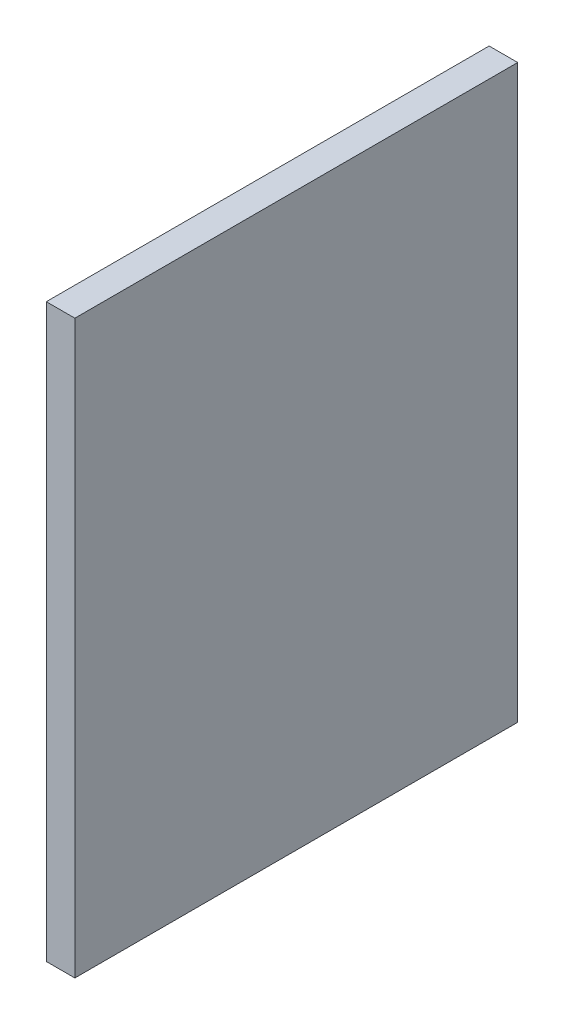
ISO-10303-21;
HEADER;
FILE_DESCRIPTION(('STEP AP214'),'2;1');
FILE_NAME('part.step','',(''),(''),'','','');
FILE_SCHEMA(('AUTOMOTIVE_DESIGN { 1 0 10303 214 1 1 1 1 }'));
ENDSEC;
DATA;
#1=APPLICATION_CONTEXT('core data for automotive mechanical design processes');
#2=APPLICATION_PROTOCOL_DEFINITION('international standard','automotive_design',2000,#1);
#3=PRODUCT_CONTEXT('',#1,'mechanical');
#4=PRODUCT('Part','Part','',(#3));
#5=PRODUCT_RELATED_PRODUCT_CATEGORY('part','',(#4));
#6=PRODUCT_DEFINITION_FORMATION('','',#4);
#7=PRODUCT_DEFINITION_CONTEXT('part definition',#1,'design');
#8=PRODUCT_DEFINITION('design','',#6,#7);
#9=PRODUCT_DEFINITION_SHAPE('','',#8);
#10=(LENGTH_UNIT() NAMED_UNIT(*) SI_UNIT(.MILLI.,.METRE.));
#11=(NAMED_UNIT(*) PLANE_ANGLE_UNIT() SI_UNIT($,.RADIAN.));
#12=(NAMED_UNIT(*) SI_UNIT($,.STERADIAN.) SOLID_ANGLE_UNIT());
#13=UNCERTAINTY_MEASURE_WITH_UNIT(LENGTH_MEASURE(1.E-05),#10,'distance_accuracy_value','');
#14=(GEOMETRIC_REPRESENTATION_CONTEXT(3) GLOBAL_UNCERTAINTY_ASSIGNED_CONTEXT((#13)) GLOBAL_UNIT_ASSIGNED_CONTEXT((#10,
#11,#12)) REPRESENTATION_CONTEXT('',''));
#15=CARTESIAN_POINT('',(0.,0.,0.));
#16=DIRECTION('',(0.,0.,1.));
#17=DIRECTION('',(1.,0.,0.));
#18=AXIS2_PLACEMENT_3D('',#15,#16,#17);
#19=CARTESIAN_POINT('',(135.,1030.,155.));
#20=DIRECTION('',(1.,0.,0.));
#21=DIRECTION('',(0.,0.,-1.));
#22=AXIS2_PLACEMENT_3D('',#19,#20,#21);
#23=PLANE('',#22);
#24=DIRECTION('',(0.,0.,1.));
#25=VECTOR('',#24,1.);
#26=CARTESIAN_POINT('',(135.,630.,155.));
#27=LINE('',#26,#25);
#28=CARTESIAN_POINT('',(135.,630.,-155.));
#29=VERTEX_POINT('',#28);
#30=CARTESIAN_POINT('',(135.,630.,155.));
#31=VERTEX_POINT('',#30);
#32=EDGE_CURVE('E107',#29,#31,#27,.T.);
#33=ORIENTED_EDGE('',*,*,#32,.T.);
#34=DIRECTION('',(0.,-1.,0.));
#35=VECTOR('',#34,1.);
#36=CARTESIAN_POINT('',(135.,1030.,155.));
#37=LINE('',#36,#35);
#38=CARTESIAN_POINT('',(135.,1030.,155.));
#39=VERTEX_POINT('',#38);
#40=EDGE_CURVE('E11',#39,#31,#37,.T.);
#41=ORIENTED_EDGE('',*,*,#40,.F.);
#42=DIRECTION('',(0.,0.,1.));
#43=VECTOR('',#42,1.);
#44=CARTESIAN_POINT('',(135.,1030.,155.));
#45=LINE('',#44,#43);
#46=CARTESIAN_POINT('',(135.,1030.,-155.));
#47=VERTEX_POINT('',#46);
#48=EDGE_CURVE('E91',#47,#39,#45,.T.);
#49=ORIENTED_EDGE('',*,*,#48,.F.);
#50=DIRECTION('',(0.,-1.,0.));
#51=VECTOR('',#50,1.);
#52=CARTESIAN_POINT('',(135.,1030.,-155.));
#53=LINE('',#52,#51);
#54=EDGE_CURVE('E103',#47,#29,#53,.T.);
#55=ORIENTED_EDGE('',*,*,#54,.T.);
#56=EDGE_LOOP('',(#33,#41,#49,#55));
#57=FACE_BOUND('',#56,.T.);
#58=ADVANCED_FACE('F39',(#57),#23,.F.);
#59=CARTESIAN_POINT('',(135.,1030.,155.));
#60=DIRECTION('',(0.,0.,-1.));
#61=DIRECTION('',(-1.,0.,0.));
#62=AXIS2_PLACEMENT_3D('',#59,#60,#61);
#63=PLANE('',#62);
#64=DIRECTION('',(1.,0.,0.));
#65=VECTOR('',#64,1.);
#66=CARTESIAN_POINT('',(135.,630.,155.));
#67=LINE('',#66,#65);
#68=CARTESIAN_POINT('',(155.,630.,155.));
#69=VERTEX_POINT('',#68);
#70=EDGE_CURVE('E96',#31,#69,#67,.T.);
#71=ORIENTED_EDGE('',*,*,#70,.T.);
#72=DIRECTION('',(0.,-1.,0.));
#73=VECTOR('',#72,1.);
#74=CARTESIAN_POINT('',(155.,1030.,155.));
#75=LINE('',#74,#73);
#76=CARTESIAN_POINT('',(155.,1030.,155.));
#77=VERTEX_POINT('',#76);
#78=EDGE_CURVE('E48',#77,#69,#75,.T.);
#79=ORIENTED_EDGE('',*,*,#78,.F.);
#80=DIRECTION('',(1.,0.,0.));
#81=VECTOR('',#80,1.);
#82=CARTESIAN_POINT('',(135.,1030.,155.));
#83=LINE('',#82,#81);
#84=EDGE_CURVE('E86',#39,#77,#83,.T.);
#85=ORIENTED_EDGE('',*,*,#84,.F.);
#86=ORIENTED_EDGE('',*,*,#40,.T.);
#87=EDGE_LOOP('',(#71,#79,#85,#86));
#88=FACE_BOUND('',#87,.T.);
#89=ADVANCED_FACE('F95',(#88),#63,.F.);
#90=CARTESIAN_POINT('',(155.,1030.,155.));
#91=DIRECTION('',(-1.,0.,0.));
#92=DIRECTION('',(0.,0.,1.));
#93=AXIS2_PLACEMENT_3D('',#90,#91,#92);
#94=PLANE('',#93);
#95=DIRECTION('',(0.,0.,-1.));
#96=VECTOR('',#95,1.);
#97=CARTESIAN_POINT('',(155.,630.,155.));
#98=LINE('',#97,#96);
#99=CARTESIAN_POINT('',(155.,630.,-155.));
#100=VERTEX_POINT('',#99);
#101=EDGE_CURVE('E73',#69,#100,#98,.T.);
#102=ORIENTED_EDGE('',*,*,#101,.T.);
#103=DIRECTION('',(0.,-1.,0.));
#104=VECTOR('',#103,1.);
#105=CARTESIAN_POINT('',(155.,1030.,-155.));
#106=LINE('',#105,#104);
#107=CARTESIAN_POINT('',(155.,1030.,-155.));
#108=VERTEX_POINT('',#107);
#109=EDGE_CURVE('E98',#108,#100,#106,.T.);
#110=ORIENTED_EDGE('',*,*,#109,.F.);
#111=DIRECTION('',(0.,0.,-1.));
#112=VECTOR('',#111,1.);
#113=CARTESIAN_POINT('',(155.,1030.,155.));
#114=LINE('',#113,#112);
#115=EDGE_CURVE('E89',#77,#108,#114,.T.);
#116=ORIENTED_EDGE('',*,*,#115,.F.);
#117=ORIENTED_EDGE('',*,*,#78,.T.);
#118=EDGE_LOOP('',(#102,#110,#116,#117));
#119=FACE_BOUND('',#118,.T.);
#120=ADVANCED_FACE('F99',(#119),#94,.F.);
#121=CARTESIAN_POINT('',(135.,1030.,-155.));
#122=DIRECTION('',(0.,0.,1.));
#123=DIRECTION('',(1.,0.,0.));
#124=AXIS2_PLACEMENT_3D('',#121,#122,#123);
#125=PLANE('',#124);
#126=DIRECTION('',(-1.,0.,0.));
#127=VECTOR('',#126,1.);
#128=CARTESIAN_POINT('',(135.,630.,-155.));
#129=LINE('',#128,#127);
#130=EDGE_CURVE('E79',#100,#29,#129,.T.);
#131=ORIENTED_EDGE('',*,*,#130,.T.);
#132=ORIENTED_EDGE('',*,*,#54,.F.);
#133=DIRECTION('',(-1.,0.,0.));
#134=VECTOR('',#133,1.);
#135=CARTESIAN_POINT('',(135.,1030.,-155.));
#136=LINE('',#135,#134);
#137=EDGE_CURVE('E56',#108,#47,#136,.T.);
#138=ORIENTED_EDGE('',*,*,#137,.F.);
#139=ORIENTED_EDGE('',*,*,#109,.T.);
#140=EDGE_LOOP('',(#131,#132,#138,#139));
#141=FACE_BOUND('',#140,.T.);
#142=ADVANCED_FACE('F120',(#141),#125,.F.);
#143=CARTESIAN_POINT('',(0.,1030.,0.));
#144=DIRECTION('',(0.,-1.,0.));
#145=DIRECTION('',(0.,0.,-1.));
#146=AXIS2_PLACEMENT_3D('',#143,#144,#145);
#147=PLANE('',#146);
#148=ORIENTED_EDGE('',*,*,#48,.T.);
#149=ORIENTED_EDGE('',*,*,#84,.T.);
#150=ORIENTED_EDGE('',*,*,#115,.T.);
#151=ORIENTED_EDGE('',*,*,#137,.T.);
#152=EDGE_LOOP('',(#148,#149,#150,#151));
#153=FACE_BOUND('',#152,.T.);
#154=ADVANCED_FACE('F87',(#153),#147,.F.);
#155=CARTESIAN_POINT('',(0.,630.,0.));
#156=DIRECTION('',(0.,-1.,0.));
#157=DIRECTION('',(0.,0.,-1.));
#158=AXIS2_PLACEMENT_3D('',#155,#156,#157);
#159=PLANE('',#158);
#160=ORIENTED_EDGE('',*,*,#32,.F.);
#161=ORIENTED_EDGE('',*,*,#130,.F.);
#162=ORIENTED_EDGE('',*,*,#101,.F.);
#163=ORIENTED_EDGE('',*,*,#70,.F.);
#164=EDGE_LOOP('',(#160,#161,#162,#163));
#165=FACE_BOUND('',#164,.T.);
#166=ADVANCED_FACE('F123',(#165),#159,.T.);
#167=CLOSED_SHELL('',(#58,#89,#120,#142,#154,#166));
#168=MANIFOLD_SOLID_BREP('B2',#167);
#169=ADVANCED_BREP_SHAPE_REPRESENTATION('',(#18,#168),#14);
#170=SHAPE_DEFINITION_REPRESENTATION(#9,#169);
ENDSEC;
END-ISO-10303-21;
